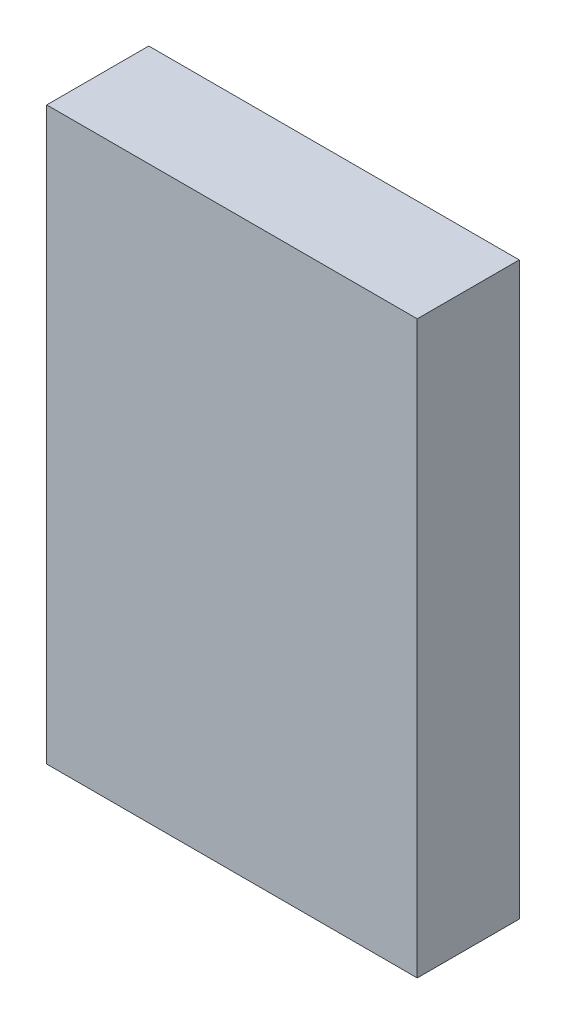
ISO-10303-21;
HEADER;
FILE_DESCRIPTION(('STEP AP214'),'2;1');
FILE_NAME('part.step','',(''),(''),'','','');
FILE_SCHEMA(('AUTOMOTIVE_DESIGN { 1 0 10303 214 1 1 1 1 }'));
ENDSEC;
DATA;
#1=APPLICATION_CONTEXT('core data for automotive mechanical design processes');
#2=APPLICATION_PROTOCOL_DEFINITION('international standard','automotive_design',2000,#1);
#3=PRODUCT_CONTEXT('',#1,'mechanical');
#4=PRODUCT('Part','Part','',(#3));
#5=PRODUCT_RELATED_PRODUCT_CATEGORY('part','',(#4));
#6=PRODUCT_DEFINITION_FORMATION('','',#4);
#7=PRODUCT_DEFINITION_CONTEXT('part definition',#1,'design');
#8=PRODUCT_DEFINITION('design','',#6,#7);
#9=PRODUCT_DEFINITION_SHAPE('','',#8);
#10=(LENGTH_UNIT() NAMED_UNIT(*) SI_UNIT(.MILLI.,.METRE.));
#11=(NAMED_UNIT(*) PLANE_ANGLE_UNIT() SI_UNIT($,.RADIAN.));
#12=(NAMED_UNIT(*) SI_UNIT($,.STERADIAN.) SOLID_ANGLE_UNIT());
#13=UNCERTAINTY_MEASURE_WITH_UNIT(LENGTH_MEASURE(1.E-05),#10,'distance_accuracy_value','');
#14=(GEOMETRIC_REPRESENTATION_CONTEXT(3) GLOBAL_UNCERTAINTY_ASSIGNED_CONTEXT((#13)) GLOBAL_UNIT_ASSIGNED_CONTEXT((#10,
#11,#12)) REPRESENTATION_CONTEXT('',''));
#15=CARTESIAN_POINT('',(0.,0.,0.));
#16=DIRECTION('',(0.,0.,1.));
#17=DIRECTION('',(1.,0.,0.));
#18=AXIS2_PLACEMENT_3D('',#15,#16,#17);
#19=CARTESIAN_POINT('',(-60.0311997987015,185.,-16.5284140414927));
#20=DIRECTION('',(0.,0.,1.));
#21=DIRECTION('',(1.,0.,0.));
#22=AXIS2_PLACEMENT_3D('',#19,#20,#21);
#23=PLANE('',#22);
#24=DIRECTION('',(0.294185369650994,-0.95574838126115,0.));
#25=VECTOR('',#24,1.);
#26=CARTESIAN_POINT('',(18.318675865846,126.434470158317,-16.5284140414927));
#27=LINE('',#26,#25);
#28=CARTESIAN_POINT('',(18.3186758658462,126.434470158317,-16.5284140414927));
#29=VERTEX_POINT('',#28);
#30=CARTESIAN_POINT('',(57.2360018790709,0.,-16.5284140414927));
#31=VERTEX_POINT('',#30);
#32=EDGE_CURVE('E199',#29,#31,#27,.T.);
#33=ORIENTED_EDGE('',*,*,#32,.F.);
#34=CARTESIAN_POINT('',(-14.7698838771279,116.249603126305,-16.5284140414927));
#35=DIRECTION('',(0.,0.,1.));
#36=DIRECTION('',(1.,0.,0.));
#37=AXIS2_PLACEMENT_3D('',#34,#35,#36);
#38=CIRCLE('',#37,34.6205762852692);
#39=CARTESIAN_POINT('',(-14.769883877128,150.870179411574,-16.5284140414927));
#40=VERTEX_POINT('',#39);
#41=EDGE_CURVE('E11',#40,#29,#38,.F.);
#42=ORIENTED_EDGE('',*,*,#41,.F.);
#43=DIRECTION('',(1.,0.,0.));
#44=VECTOR('',#43,1.);
#45=CARTESIAN_POINT('',(-61.0311997987015,150.870179411574,-16.5284140414927));
#46=LINE('',#45,#44);
#47=CARTESIAN_POINT('',(-60.0311997987015,150.870179411574,-16.5284140414927));
#48=VERTEX_POINT('',#47);
#49=EDGE_CURVE('E224',#48,#40,#46,.T.);
#50=ORIENTED_EDGE('',*,*,#49,.F.);
#51=DIRECTION('',(0.,-1.,0.));
#52=VECTOR('',#51,1.);
#53=CARTESIAN_POINT('',(-60.0311997987015,185.,-16.5284140414927));
#54=LINE('',#53,#52);
#55=CARTESIAN_POINT('',(-60.0311997987015,185.,-16.5284140414927));
#56=VERTEX_POINT('',#55);
#57=EDGE_CURVE('E257',#56,#48,#54,.T.);
#58=ORIENTED_EDGE('',*,*,#57,.F.);
#59=DIRECTION('',(-1.,0.,0.));
#60=VECTOR('',#59,1.);
#61=CARTESIAN_POINT('',(-60.0311997987015,185.,-16.5284140414927));
#62=LINE('',#61,#60);
#63=CARTESIAN_POINT('',(60.0311997987015,185.,-16.5284140414927));
#64=VERTEX_POINT('',#63);
#65=EDGE_CURVE('E97',#64,#56,#62,.T.);
#66=ORIENTED_EDGE('',*,*,#65,.F.);
#67=DIRECTION('',(0.,-1.,0.));
#68=VECTOR('',#67,1.);
#69=CARTESIAN_POINT('',(60.0311997987015,185.,-16.5284140414927));
#70=LINE('',#69,#68);
#71=CARTESIAN_POINT('',(60.0311997987015,0.,-16.5284140414927));
#72=VERTEX_POINT('',#71);
#73=EDGE_CURVE('E261',#64,#72,#70,.T.);
#74=ORIENTED_EDGE('',*,*,#73,.T.);
#75=DIRECTION('',(-1.,0.,0.));
#76=VECTOR('',#75,1.);
#77=CARTESIAN_POINT('',(-60.0311997987015,0.,-16.5284140414927));
#78=LINE('',#77,#76);
#79=EDGE_CURVE('E242',#72,#31,#78,.T.);
#80=ORIENTED_EDGE('',*,*,#79,.T.);
#81=EDGE_LOOP('',(#33,#42,#50,#58,#66,#74,#80));
#82=FACE_BOUND('',#81,.T.);
#83=ADVANCED_FACE('F43',(#82),#23,.F.);
#84=DIRECTION('',(0.294185369650994,-0.95574838126115,0.));
#85=VECTOR('',#84,1.);
#86=CARTESIAN_POINT('',(-9.62850836965575,117.832150880333,-16.5284140414927));
#87=LINE('',#86,#85);
#88=CARTESIAN_POINT('',(26.6409696050399,0.,-16.5284140414927));
#89=VERTEX_POINT('',#88);
#90=CARTESIAN_POINT('',(-9.6285083696556,117.832150880333,-16.5284140414927));
#91=VERTEX_POINT('',#90);
#92=EDGE_CURVE('E196',#89,#91,#87,.F.);
#93=ORIENTED_EDGE('',*,*,#92,.F.);
#94=CARTESIAN_POINT('',(-60.0311997987015,0.,-16.5284140414927));
#95=VERTEX_POINT('',#94);
#96=EDGE_CURVE('E194',#89,#95,#78,.T.);
#97=ORIENTED_EDGE('',*,*,#96,.T.);
#98=CARTESIAN_POINT('',(-60.0311997987015,121.629026841036,-16.5284140414927));
#99=VERTEX_POINT('',#98);
#100=EDGE_CURVE('E256',#99,#95,#54,.T.);
#101=ORIENTED_EDGE('',*,*,#100,.F.);
#102=DIRECTION('',(1.,0.,0.));
#103=VECTOR('',#102,1.);
#104=CARTESIAN_POINT('',(-61.0311997987015,121.629026841036,-16.5284140414927));
#105=LINE('',#104,#103);
#106=CARTESIAN_POINT('',(-14.769883877128,121.629026841036,-16.5284140414927));
#107=VERTEX_POINT('',#106);
#108=EDGE_CURVE('E221',#107,#99,#105,.F.);
#109=ORIENTED_EDGE('',*,*,#108,.F.);
#110=CARTESIAN_POINT('',(-14.7698838771279,116.249603126305,-16.5284140414927));
#111=DIRECTION('',(0.,0.,-1.));
#112=DIRECTION('',(-1.,0.,0.));
#113=AXIS2_PLACEMENT_3D('',#110,#111,#112);
#114=CIRCLE('',#113,5.37942371473145);
#115=EDGE_CURVE('E52',#91,#107,#114,.F.);
#116=ORIENTED_EDGE('',*,*,#115,.F.);
#117=EDGE_LOOP('',(#93,#97,#101,#109,#116));
#118=FACE_BOUND('',#117,.T.);
#119=ADVANCED_FACE('F390',(#118),#23,.F.);
#120=CARTESIAN_POINT('',(60.0311997987015,185.,16.5284140414927));
#121=DIRECTION('',(-1.,0.,0.));
#122=DIRECTION('',(0.,0.,1.));
#123=AXIS2_PLACEMENT_3D('',#120,#121,#122);
#124=PLANE('',#123);
#125=DIRECTION('',(0.,0.,-1.));
#126=VECTOR('',#125,1.);
#127=CARTESIAN_POINT('',(60.0311997987015,0.,16.5284140414927));
#128=LINE('',#127,#126);
#129=CARTESIAN_POINT('',(60.0311997987015,0.,16.5284140414927));
#130=VERTEX_POINT('',#129);
#131=EDGE_CURVE('E227',#130,#72,#128,.T.);
#132=ORIENTED_EDGE('',*,*,#131,.T.);
#133=ORIENTED_EDGE('',*,*,#73,.F.);
#134=DIRECTION('',(0.,0.,-1.));
#135=VECTOR('',#134,1.);
#136=CARTESIAN_POINT('',(60.0311997987015,185.,16.5284140414927));
#137=LINE('',#136,#135);
#138=CARTESIAN_POINT('',(60.0311997987015,185.,16.5284140414927));
#139=VERTEX_POINT('',#138);
#140=EDGE_CURVE('E228',#139,#64,#137,.T.);
#141=ORIENTED_EDGE('',*,*,#140,.F.);
#142=DIRECTION('',(0.,-1.,0.));
#143=VECTOR('',#142,1.);
#144=CARTESIAN_POINT('',(60.0311997987015,185.,16.5284140414927));
#145=LINE('',#144,#143);
#146=EDGE_CURVE('E238',#139,#130,#145,.T.);
#147=ORIENTED_EDGE('',*,*,#146,.T.);
#148=EDGE_LOOP('',(#132,#133,#141,#147));
#149=FACE_BOUND('',#148,.T.);
#150=ADVANCED_FACE('F45',(#149),#124,.F.);
#151=CARTESIAN_POINT('',(-60.0311997987015,185.,16.5284140414927));
#152=DIRECTION('',(1.,0.,0.));
#153=DIRECTION('',(0.,0.,-1.));
#154=AXIS2_PLACEMENT_3D('',#151,#152,#153);
#155=PLANE('',#154);
#156=DIRECTION('',(0.,0.,-1.));
#157=VECTOR('',#156,1.);
#158=CARTESIAN_POINT('',(-60.0311997987015,127.771476102538,6.29921731849201));
#159=LINE('',#158,#157);
#160=CARTESIAN_POINT('',(-60.0311997987015,127.771476102538,6.29921731849201));
#161=VERTEX_POINT('',#160);
#162=CARTESIAN_POINT('',(-60.0311997987015,127.771476102538,-4.61696521768333));
#163=VERTEX_POINT('',#162);
#164=EDGE_CURVE('E283',#161,#163,#159,.T.);
#165=ORIENTED_EDGE('',*,*,#164,.T.);
#166=CARTESIAN_POINT('',(-60.0311997987015,136.249603126305,-16.5284140414927));
#167=DIRECTION('',(1.,0.,0.));
#168=DIRECTION('',(0.,0.,-1.));
#169=AXIS2_PLACEMENT_3D('',#166,#167,#168);
#170=CIRCLE('',#169,14.6205762852689);
#171=EDGE_CURVE('E278',#163,#99,#170,.T.);
#172=ORIENTED_EDGE('',*,*,#171,.T.);
#173=ORIENTED_EDGE('',*,*,#100,.T.);
#174=DIRECTION('',(0.,0.,1.));
#175=VECTOR('',#174,1.);
#176=CARTESIAN_POINT('',(-60.0311997987015,0.,16.5284140414927));
#177=LINE('',#176,#175);
#178=CARTESIAN_POINT('',(-60.0311997987015,0.,16.5284140414927));
#179=VERTEX_POINT('',#178);
#180=EDGE_CURVE('E246',#95,#179,#177,.T.);
#181=ORIENTED_EDGE('',*,*,#180,.T.);
#182=DIRECTION('',(0.,-1.,0.));
#183=VECTOR('',#182,1.);
#184=CARTESIAN_POINT('',(-60.0311997987015,185.,16.5284140414927));
#185=LINE('',#184,#183);
#186=CARTESIAN_POINT('',(-60.0311997987015,185.,16.5284140414927));
#187=VERTEX_POINT('',#186);
#188=EDGE_CURVE('E253',#187,#179,#185,.T.);
#189=ORIENTED_EDGE('',*,*,#188,.F.);
#190=DIRECTION('',(0.,0.,1.));
#191=VECTOR('',#190,1.);
#192=CARTESIAN_POINT('',(-60.0311997987015,185.,16.5284140414927));
#193=LINE('',#192,#191);
#194=EDGE_CURVE('E233',#56,#187,#193,.T.);
#195=ORIENTED_EDGE('',*,*,#194,.F.);
#196=ORIENTED_EDGE('',*,*,#57,.T.);
#197=CARTESIAN_POINT('',(-60.0311997987015,136.249603126305,-16.5284140414927));
#198=DIRECTION('',(1.,0.,0.));
#199=DIRECTION('',(0.,0.,-1.));
#200=AXIS2_PLACEMENT_3D('',#197,#198,#199);
#201=CIRCLE('',#200,14.6205762852689);
#202=CARTESIAN_POINT('',(-60.0311997987015,144.727730150073,-4.61696521768333));
#203=VERTEX_POINT('',#202);
#204=EDGE_CURVE('E264',#48,#203,#201,.T.);
#205=ORIENTED_EDGE('',*,*,#204,.T.);
#206=DIRECTION('',(0.,0.,1.));
#207=VECTOR('',#206,1.);
#208=CARTESIAN_POINT('',(-60.0311997987015,144.727730150073,6.29921731849201));
#209=LINE('',#208,#207);
#210=CARTESIAN_POINT('',(-60.0311997987015,144.727730150073,6.29921731849201));
#211=VERTEX_POINT('',#210);
#212=EDGE_CURVE('E375',#203,#211,#209,.T.);
#213=ORIENTED_EDGE('',*,*,#212,.T.);
#214=DIRECTION('',(0.,-1.,0.));
#215=VECTOR('',#214,1.);
#216=CARTESIAN_POINT('',(-60.0311997987015,127.771476102538,6.29921731849201));
#217=LINE('',#216,#215);
#218=EDGE_CURVE('E287',#211,#161,#217,.T.);
#219=ORIENTED_EDGE('',*,*,#218,.T.);
#220=EDGE_LOOP('',(#165,#172,#173,#181,#189,#195,#196,#205,#213,#219));
#221=FACE_BOUND('',#220,.T.);
#222=ADVANCED_FACE('F387',(#221),#155,.F.);
#223=CARTESIAN_POINT('',(-60.0311997987015,185.,16.5284140414927));
#224=DIRECTION('',(0.,0.,-1.));
#225=DIRECTION('',(-1.,0.,0.));
#226=AXIS2_PLACEMENT_3D('',#223,#224,#225);
#227=PLANE('',#226);
#228=DIRECTION('',(1.,0.,0.));
#229=VECTOR('',#228,1.);
#230=CARTESIAN_POINT('',(-60.0311997987015,0.,16.5284140414927));
#231=LINE('',#230,#229);
#232=EDGE_CURVE('E89',#179,#130,#231,.T.);
#233=ORIENTED_EDGE('',*,*,#232,.T.);
#234=ORIENTED_EDGE('',*,*,#146,.F.);
#235=DIRECTION('',(1.,0.,0.));
#236=VECTOR('',#235,1.);
#237=CARTESIAN_POINT('',(-60.0311997987015,185.,16.5284140414927));
#238=LINE('',#237,#236);
#239=EDGE_CURVE('E68',#187,#139,#238,.T.);
#240=ORIENTED_EDGE('',*,*,#239,.F.);
#241=ORIENTED_EDGE('',*,*,#188,.T.);
#242=EDGE_LOOP('',(#233,#234,#240,#241));
#243=FACE_BOUND('',#242,.T.);
#244=ADVANCED_FACE('F395',(#243),#227,.F.);
#245=CARTESIAN_POINT('',(0.,185.,0.));
#246=DIRECTION('',(0.,-1.,0.));
#247=DIRECTION('',(0.,0.,-1.));
#248=AXIS2_PLACEMENT_3D('',#245,#246,#247);
#249=PLANE('',#248);
#250=ORIENTED_EDGE('',*,*,#140,.T.);
#251=ORIENTED_EDGE('',*,*,#65,.T.);
#252=ORIENTED_EDGE('',*,*,#194,.T.);
#253=ORIENTED_EDGE('',*,*,#239,.T.);
#254=EDGE_LOOP('',(#250,#251,#252,#253));
#255=FACE_BOUND('',#254,.T.);
#256=ADVANCED_FACE('F399',(#255),#249,.F.);
#257=CARTESIAN_POINT('',(0.,0.,0.));
#258=DIRECTION('',(0.,-1.,0.));
#259=DIRECTION('',(0.,0.,-1.));
#260=AXIS2_PLACEMENT_3D('',#257,#258,#259);
#261=PLANE('',#260);
#262=CARTESIAN_POINT('',(41.9384857420554,0.,-16.5284140414927));
#263=DIRECTION('',(0.,-1.,0.));
#264=DIRECTION('',(1.,0.,0.));
#265=AXIS2_PLACEMENT_3D('',#262,#263,#264);
#266=ELLIPSE('',#265,15.2975161370155,14.6205762852689);
#267=CARTESIAN_POINT('',(50.8091542045856,0.,-4.61696521768333));
#268=VERTEX_POINT('',#267);
#269=EDGE_CURVE('E202',#31,#268,#266,.T.);
#270=ORIENTED_EDGE('',*,*,#269,.F.);
#271=ORIENTED_EDGE('',*,*,#79,.F.);
#272=ORIENTED_EDGE('',*,*,#131,.F.);
#273=ORIENTED_EDGE('',*,*,#232,.F.);
#274=ORIENTED_EDGE('',*,*,#180,.F.);
#275=ORIENTED_EDGE('',*,*,#96,.F.);
#276=CARTESIAN_POINT('',(41.9384857420554,0.,-16.5284140414927));
#277=DIRECTION('',(0.,-1.,0.));
#278=DIRECTION('',(1.,0.,0.));
#279=AXIS2_PLACEMENT_3D('',#276,#277,#278);
#280=ELLIPSE('',#279,15.2975161370155,14.6205762852689);
#281=CARTESIAN_POINT('',(33.0678172795253,0.,-4.61696521768333));
#282=VERTEX_POINT('',#281);
#283=EDGE_CURVE('E170',#282,#89,#280,.T.);
#284=ORIENTED_EDGE('',*,*,#283,.F.);
#285=DIRECTION('',(0.,0.,-1.));
#286=VECTOR('',#285,1.);
#287=CARTESIAN_POINT('',(33.0678172795253,0.,6.29921731849201));
#288=LINE('',#287,#286);
#289=CARTESIAN_POINT('',(33.0678172795253,0.,6.29921731849201));
#290=VERTEX_POINT('',#289);
#291=EDGE_CURVE('E181',#290,#282,#288,.T.);
#292=ORIENTED_EDGE('',*,*,#291,.F.);
#293=DIRECTION('',(-1.,0.,0.));
#294=VECTOR('',#293,1.);
#295=CARTESIAN_POINT('',(-3.75787243099708,0.,6.29921731849201));
#296=LINE('',#295,#294);
#297=CARTESIAN_POINT('',(50.8091542045856,0.,6.29921731849201));
#298=VERTEX_POINT('',#297);
#299=EDGE_CURVE('E187',#298,#290,#296,.T.);
#300=ORIENTED_EDGE('',*,*,#299,.F.);
#301=DIRECTION('',(0.,0.,1.));
#302=VECTOR('',#301,1.);
#303=CARTESIAN_POINT('',(50.8091542045856,0.,6.29921731849201));
#304=LINE('',#303,#302);
#305=EDGE_CURVE('E207',#268,#298,#304,.T.);
#306=ORIENTED_EDGE('',*,*,#305,.F.);
#307=EDGE_LOOP('',(#270,#271,#272,#273,#274,#275,#284,#292,#300,#306));
#308=FACE_BOUND('',#307,.T.);
#309=ADVANCED_FACE('F191',(#308),#261,.T.);
#310=CARTESIAN_POINT('',(-14.7698838771279,116.249603126305,-16.5284140414927));
#311=DIRECTION('',(0.,0.,-1.));
#312=DIRECTION('',(-1.,0.,0.));
#313=AXIS2_PLACEMENT_3D('',#310,#311,#312);
#314=TOROIDAL_SURFACE('',#313,20.0000000000003,14.6205762852689);
#315=ORIENTED_EDGE('',*,*,#41,.T.);
#316=CARTESIAN_POINT('',(4.34508374809515,122.133310519325,-16.5284140414927));
#317=DIRECTION('',(-0.294185369650989,0.955748381261151,0.));
#318=DIRECTION('',(0.,0.,1.));
#319=AXIS2_PLACEMENT_3D('',#316,#317,#318);
#320=CIRCLE('',#319,14.6205762852689);
#321=CARTESIAN_POINT('',(12.4480399271877,124.62745145176,-4.61696521768333));
#322=VERTEX_POINT('',#321);
#323=EDGE_CURVE('E313',#322,#29,#320,.T.);
#324=ORIENTED_EDGE('',*,*,#323,.F.);
#325=CARTESIAN_POINT('',(-14.7698838771279,116.249603126305,-4.61696521768333));
#326=DIRECTION('',(0.,0.,-1.));
#327=DIRECTION('',(0.,1.,0.));
#328=AXIS2_PLACEMENT_3D('',#325,#326,#327);
#329=CIRCLE('',#328,28.4781270237679);
#330=CARTESIAN_POINT('',(-14.769883877128,144.727730150073,-4.61696521768333));
#331=VERTEX_POINT('',#330);
#332=EDGE_CURVE('E317',#331,#322,#329,.T.);
#333=ORIENTED_EDGE('',*,*,#332,.F.);
#334=CARTESIAN_POINT('',(-14.769883877128,136.249603126305,-16.5284140414927));
#335=DIRECTION('',(-1.,0.,0.));
#336=DIRECTION('',(0.,0.,1.));
#337=AXIS2_PLACEMENT_3D('',#334,#335,#336);
#338=CIRCLE('',#337,14.6205762852689);
#339=EDGE_CURVE('E276',#331,#40,#338,.T.);
#340=ORIENTED_EDGE('',*,*,#339,.T.);
#341=EDGE_LOOP('',(#315,#324,#333,#340));
#342=FACE_BOUND('',#341,.T.);
#343=ADVANCED_FACE('F334',(#342),#314,.F.);
#344=CARTESIAN_POINT('',(-14.7698838771279,116.249603126305,-16.5284140414927));
#345=DIRECTION('',(0.,0.,-1.));
#346=DIRECTION('',(-1.,0.,0.));
#347=AXIS2_PLACEMENT_3D('',#344,#345,#346);
#348=TOROIDAL_SURFACE('',#347,20.0000000000003,14.6205762852689);
#349=ORIENTED_EDGE('',*,*,#115,.T.);
#350=CARTESIAN_POINT('',(-14.769883877128,136.249603126305,-16.5284140414927));
#351=DIRECTION('',(-1.,0.,0.));
#352=DIRECTION('',(0.,0.,1.));
#353=AXIS2_PLACEMENT_3D('',#350,#351,#352);
#354=CIRCLE('',#353,14.6205762852689);
#355=CARTESIAN_POINT('',(-14.769883877128,127.771476102538,-4.61696521768333));
#356=VERTEX_POINT('',#355);
#357=EDGE_CURVE('E282',#107,#356,#354,.T.);
#358=ORIENTED_EDGE('',*,*,#357,.T.);
#359=CARTESIAN_POINT('',(-14.7698838771279,116.249603126305,-4.61696521768333));
#360=DIRECTION('',(0.,0.,-1.));
#361=DIRECTION('',(0.,1.,0.));
#362=AXIS2_PLACEMENT_3D('',#359,#360,#361);
#363=CIRCLE('',#362,11.5218729762328);
#364=CARTESIAN_POINT('',(-3.75787243099675,119.63916958689,-4.61696521768333));
#365=VERTEX_POINT('',#364);
#366=EDGE_CURVE('E307',#356,#365,#363,.T.);
#367=ORIENTED_EDGE('',*,*,#366,.T.);
#368=CARTESIAN_POINT('',(4.34508374809515,122.133310519325,-16.5284140414927));
#369=DIRECTION('',(-0.294185369650989,0.955748381261151,0.));
#370=DIRECTION('',(0.,0.,1.));
#371=AXIS2_PLACEMENT_3D('',#368,#369,#370);
#372=CIRCLE('',#371,14.6205762852689);
#373=EDGE_CURVE('E173',#91,#365,#372,.T.);
#374=ORIENTED_EDGE('',*,*,#373,.F.);
#375=EDGE_LOOP('',(#349,#358,#367,#374));
#376=FACE_BOUND('',#375,.T.);
#377=ADVANCED_FACE('F379',(#376),#348,.F.);
#378=CARTESIAN_POINT('',(-61.0311997987015,136.249603126305,-16.5284140414927));
#379=DIRECTION('',(1.,0.,0.));
#380=DIRECTION('',(0.,0.,-1.));
#381=AXIS2_PLACEMENT_3D('',#378,#379,#380);
#382=CYLINDRICAL_SURFACE('',#381,14.6205762852689);
#383=ORIENTED_EDGE('',*,*,#49,.T.);
#384=ORIENTED_EDGE('',*,*,#339,.F.);
#385=DIRECTION('',(1.,0.,0.));
#386=VECTOR('',#385,1.);
#387=CARTESIAN_POINT('',(-61.0311997987015,144.727730150073,-4.61696521768333));
#388=LINE('',#387,#386);
#389=EDGE_CURVE('E214',#203,#331,#388,.T.);
#390=ORIENTED_EDGE('',*,*,#389,.F.);
#391=ORIENTED_EDGE('',*,*,#204,.F.);
#392=EDGE_LOOP('',(#383,#384,#390,#391));
#393=FACE_BOUND('',#392,.T.);
#394=ADVANCED_FACE('F460',(#393),#382,.F.);
#395=CARTESIAN_POINT('',(-61.0311997987015,136.249603126305,-16.5284140414927));
#396=DIRECTION('',(1.,0.,0.));
#397=DIRECTION('',(0.,0.,-1.));
#398=AXIS2_PLACEMENT_3D('',#395,#396,#397);
#399=CYLINDRICAL_SURFACE('',#398,14.6205762852689);
#400=ORIENTED_EDGE('',*,*,#108,.T.);
#401=ORIENTED_EDGE('',*,*,#171,.F.);
#402=DIRECTION('',(1.,0.,0.));
#403=VECTOR('',#402,1.);
#404=CARTESIAN_POINT('',(-61.0311997987015,127.771476102538,-4.61696521768333));
#405=LINE('',#404,#403);
#406=EDGE_CURVE('E286',#163,#356,#405,.T.);
#407=ORIENTED_EDGE('',*,*,#406,.T.);
#408=ORIENTED_EDGE('',*,*,#357,.F.);
#409=EDGE_LOOP('',(#400,#401,#407,#408));
#410=FACE_BOUND('',#409,.T.);
#411=ADVANCED_FACE('F383',(#410),#399,.F.);
#412=CARTESIAN_POINT('',(4.34508374809514,122.133310519325,-16.5284140414927));
#413=DIRECTION('',(0.294185369650994,-0.95574838126115,0.));
#414=DIRECTION('',(0.95574838126115,0.294185369650994,0.));
#415=AXIS2_PLACEMENT_3D('',#412,#413,#414);
#416=CYLINDRICAL_SURFACE('',#415,14.6205762852689);
#417=ORIENTED_EDGE('',*,*,#32,.T.);
#418=ORIENTED_EDGE('',*,*,#269,.T.);
#419=DIRECTION('',(0.294185369650994,-0.95574838126115,0.));
#420=VECTOR('',#419,1.);
#421=CARTESIAN_POINT('',(12.4480399271874,124.62745145176,-4.61696521768333));
#422=LINE('',#421,#420);
#423=EDGE_CURVE('E59',#322,#268,#422,.T.);
#424=ORIENTED_EDGE('',*,*,#423,.F.);
#425=ORIENTED_EDGE('',*,*,#323,.T.);
#426=EDGE_LOOP('',(#417,#418,#424,#425));
#427=FACE_BOUND('',#426,.T.);
#428=ADVANCED_FACE('F341',(#427),#416,.F.);
#429=CARTESIAN_POINT('',(4.34508374809514,122.133310519325,-16.5284140414927));
#430=DIRECTION('',(0.294185369650994,-0.95574838126115,0.));
#431=DIRECTION('',(0.95574838126115,0.294185369650994,0.));
#432=AXIS2_PLACEMENT_3D('',#429,#430,#431);
#433=CYLINDRICAL_SURFACE('',#432,14.6205762852689);
#434=ORIENTED_EDGE('',*,*,#92,.T.);
#435=ORIENTED_EDGE('',*,*,#373,.T.);
#436=DIRECTION('',(0.294185369650994,-0.95574838126115,0.));
#437=VECTOR('',#436,1.);
#438=CARTESIAN_POINT('',(-3.75787243099708,119.63916958689,-4.61696521768333));
#439=LINE('',#438,#437);
#440=EDGE_CURVE('E166',#365,#282,#439,.T.);
#441=ORIENTED_EDGE('',*,*,#440,.T.);
#442=ORIENTED_EDGE('',*,*,#283,.T.);
#443=EDGE_LOOP('',(#434,#435,#441,#442));
#444=FACE_BOUND('',#443,.T.);
#445=ADVANCED_FACE('F168',(#444),#433,.F.);
#446=CARTESIAN_POINT('',(-3.75787243099708,119.63916958689,6.29921731849201));
#447=DIRECTION('',(0.95574838126115,0.294185369650994,0.));
#448=DIRECTION('',(-0.294185369650994,0.95574838126115,0.));
#449=AXIS2_PLACEMENT_3D('',#446,#447,#448);
#450=PLANE('',#449);
#451=ORIENTED_EDGE('',*,*,#291,.T.);
#452=ORIENTED_EDGE('',*,*,#440,.F.);
#453=DIRECTION('',(0.,0.,1.));
#454=VECTOR('',#453,1.);
#455=CARTESIAN_POINT('',(-3.75787243099707,119.63916958689,6.29921731849201));
#456=LINE('',#455,#454);
#457=CARTESIAN_POINT('',(-3.75787243099675,119.63916958689,6.29921731849201));
#458=VERTEX_POINT('',#457);
#459=EDGE_CURVE('E311',#365,#458,#456,.T.);
#460=ORIENTED_EDGE('',*,*,#459,.T.);
#461=DIRECTION('',(0.294185369650994,-0.95574838126115,0.));
#462=VECTOR('',#461,1.);
#463=CARTESIAN_POINT('',(-3.75787243099708,119.63916958689,6.29921731849201));
#464=LINE('',#463,#462);
#465=EDGE_CURVE('E178',#458,#290,#464,.T.);
#466=ORIENTED_EDGE('',*,*,#465,.T.);
#467=EDGE_LOOP('',(#451,#452,#460,#466));
#468=FACE_BOUND('',#467,.T.);
#469=ADVANCED_FACE('F182',(#468),#450,.T.);
#470=CARTESIAN_POINT('',(-3.75787243099708,119.63916958689,6.29921731849201));
#471=DIRECTION('',(0.,0.,-1.));
#472=DIRECTION('',(-1.,0.,0.));
#473=AXIS2_PLACEMENT_3D('',#470,#471,#472);
#474=PLANE('',#473);
#475=ORIENTED_EDGE('',*,*,#299,.T.);
#476=ORIENTED_EDGE('',*,*,#465,.F.);
#477=DIRECTION('',(0.955748381261151,0.294185369650989,0.));
#478=VECTOR('',#477,1.);
#479=CARTESIAN_POINT('',(-3.75787243099707,119.63916958689,6.29921731849201));
#480=LINE('',#479,#478);
#481=CARTESIAN_POINT('',(12.4480399271877,124.62745145176,6.29921731849201));
#482=VERTEX_POINT('',#481);
#483=EDGE_CURVE('E354',#458,#482,#480,.T.);
#484=ORIENTED_EDGE('',*,*,#483,.T.);
#485=DIRECTION('',(0.294185369650994,-0.95574838126115,0.));
#486=VECTOR('',#485,1.);
#487=CARTESIAN_POINT('',(12.4480399271874,124.62745145176,6.29921731849201));
#488=LINE('',#487,#486);
#489=EDGE_CURVE('E211',#482,#298,#488,.T.);
#490=ORIENTED_EDGE('',*,*,#489,.T.);
#491=EDGE_LOOP('',(#475,#476,#484,#490));
#492=FACE_BOUND('',#491,.T.);
#493=ADVANCED_FACE('F364',(#492),#474,.T.);
#494=CARTESIAN_POINT('',(12.4480399271874,124.62745145176,6.29921731849201));
#495=DIRECTION('',(-0.95574838126115,-0.294185369650994,0.));
#496=DIRECTION('',(0.294185369650994,-0.95574838126115,0.));
#497=AXIS2_PLACEMENT_3D('',#494,#495,#496);
#498=PLANE('',#497);
#499=ORIENTED_EDGE('',*,*,#305,.T.);
#500=ORIENTED_EDGE('',*,*,#489,.F.);
#501=DIRECTION('',(0.,0.,-1.));
#502=VECTOR('',#501,1.);
#503=CARTESIAN_POINT('',(12.4480399271874,124.62745145176,6.29921731849201));
#504=LINE('',#503,#502);
#505=EDGE_CURVE('E346',#482,#322,#504,.T.);
#506=ORIENTED_EDGE('',*,*,#505,.T.);
#507=ORIENTED_EDGE('',*,*,#423,.T.);
#508=EDGE_LOOP('',(#499,#500,#506,#507));
#509=FACE_BOUND('',#508,.T.);
#510=ADVANCED_FACE('F344',(#509),#498,.T.);
#511=CARTESIAN_POINT('',(-61.0311997987015,127.771476102538,6.29921731849201));
#512=DIRECTION('',(0.,1.,0.));
#513=DIRECTION('',(0.,0.,1.));
#514=AXIS2_PLACEMENT_3D('',#511,#512,#513);
#515=PLANE('',#514);
#516=DIRECTION('',(1.,0.,0.));
#517=VECTOR('',#516,1.);
#518=CARTESIAN_POINT('',(-61.0311997987015,127.771476102538,6.29921731849201));
#519=LINE('',#518,#517);
#520=CARTESIAN_POINT('',(-14.769883877128,127.771476102538,6.29921731849201));
#521=VERTEX_POINT('',#520);
#522=EDGE_CURVE('E290',#161,#521,#519,.T.);
#523=ORIENTED_EDGE('',*,*,#522,.T.);
#524=DIRECTION('',(0.,0.,1.));
#525=VECTOR('',#524,1.);
#526=CARTESIAN_POINT('',(-14.769883877128,127.771476102538,6.29921731849201));
#527=LINE('',#526,#525);
#528=EDGE_CURVE('E291',#356,#521,#527,.T.);
#529=ORIENTED_EDGE('',*,*,#528,.F.);
#530=ORIENTED_EDGE('',*,*,#406,.F.);
#531=ORIENTED_EDGE('',*,*,#164,.F.);
#532=EDGE_LOOP('',(#523,#529,#530,#531));
#533=FACE_BOUND('',#532,.T.);
#534=ADVANCED_FACE('F385',(#533),#515,.T.);
#535=CARTESIAN_POINT('',(-61.0311997987015,127.771476102538,6.29921731849201));
#536=DIRECTION('',(0.,0.,-1.));
#537=DIRECTION('',(-1.,0.,0.));
#538=AXIS2_PLACEMENT_3D('',#535,#536,#537);
#539=PLANE('',#538);
#540=DIRECTION('',(1.,0.,0.));
#541=VECTOR('',#540,1.);
#542=CARTESIAN_POINT('',(-61.0311997987015,144.727730150073,6.29921731849201));
#543=LINE('',#542,#541);
#544=CARTESIAN_POINT('',(-14.769883877128,144.727730150073,6.29921731849201));
#545=VERTEX_POINT('',#544);
#546=EDGE_CURVE('E372',#211,#545,#543,.T.);
#547=ORIENTED_EDGE('',*,*,#546,.T.);
#548=DIRECTION('',(0.,1.,0.));
#549=VECTOR('',#548,1.);
#550=CARTESIAN_POINT('',(-14.769883877128,127.771476102538,6.29921731849201));
#551=LINE('',#550,#549);
#552=EDGE_CURVE('E294',#521,#545,#551,.T.);
#553=ORIENTED_EDGE('',*,*,#552,.F.);
#554=ORIENTED_EDGE('',*,*,#522,.F.);
#555=ORIENTED_EDGE('',*,*,#218,.F.);
#556=EDGE_LOOP('',(#547,#553,#554,#555));
#557=FACE_BOUND('',#556,.T.);
#558=ADVANCED_FACE('F532',(#557),#539,.T.);
#559=CARTESIAN_POINT('',(-61.0311997987015,144.727730150073,6.29921731849201));
#560=DIRECTION('',(0.,-1.,0.));
#561=DIRECTION('',(0.,0.,-1.));
#562=AXIS2_PLACEMENT_3D('',#559,#560,#561);
#563=PLANE('',#562);
#564=ORIENTED_EDGE('',*,*,#389,.T.);
#565=DIRECTION('',(0.,0.,-1.));
#566=VECTOR('',#565,1.);
#567=CARTESIAN_POINT('',(-14.769883877128,144.727730150073,6.29921731849201));
#568=LINE('',#567,#566);
#569=EDGE_CURVE('E321',#545,#331,#568,.T.);
#570=ORIENTED_EDGE('',*,*,#569,.F.);
#571=ORIENTED_EDGE('',*,*,#546,.F.);
#572=ORIENTED_EDGE('',*,*,#212,.F.);
#573=EDGE_LOOP('',(#564,#570,#571,#572));
#574=FACE_BOUND('',#573,.T.);
#575=ADVANCED_FACE('F542',(#574),#563,.T.);
#576=CARTESIAN_POINT('',(-14.7698838771279,116.249603126305,-16.5284140414927));
#577=DIRECTION('',(0.,0.,-1.));
#578=DIRECTION('',(-1.,0.,0.));
#579=AXIS2_PLACEMENT_3D('',#576,#577,#578);
#580=CYLINDRICAL_SURFACE('',#579,11.5218729762328);
#581=CARTESIAN_POINT('',(-14.7698838771279,116.249603126305,6.29921731849201));
#582=DIRECTION('',(0.,0.,-1.));
#583=DIRECTION('',(0.,1.,0.));
#584=AXIS2_PLACEMENT_3D('',#581,#582,#583);
#585=CIRCLE('',#584,11.5218729762328);
#586=EDGE_CURVE('E366',#521,#458,#585,.T.);
#587=ORIENTED_EDGE('',*,*,#586,.T.);
#588=ORIENTED_EDGE('',*,*,#459,.F.);
#589=ORIENTED_EDGE('',*,*,#366,.F.);
#590=ORIENTED_EDGE('',*,*,#528,.T.);
#591=EDGE_LOOP('',(#587,#588,#589,#590));
#592=FACE_BOUND('',#591,.T.);
#593=ADVANCED_FACE('F378',(#592),#580,.T.);
#594=CARTESIAN_POINT('',(-14.7698838771272,127.771476102538,6.29921731849201));
#595=DIRECTION('',(0.,0.,-1.));
#596=DIRECTION('',(-1.,0.,0.));
#597=AXIS2_PLACEMENT_3D('',#594,#595,#596);
#598=PLANE('',#597);
#599=CARTESIAN_POINT('',(-14.7698838771279,116.249603126305,6.29921731849201));
#600=DIRECTION('',(0.,0.,-1.));
#601=DIRECTION('',(0.,1.,0.));
#602=AXIS2_PLACEMENT_3D('',#599,#600,#601);
#603=CIRCLE('',#602,28.4781270237679);
#604=EDGE_CURVE('E210',#545,#482,#603,.T.);
#605=ORIENTED_EDGE('',*,*,#604,.T.);
#606=ORIENTED_EDGE('',*,*,#483,.F.);
#607=ORIENTED_EDGE('',*,*,#586,.F.);
#608=ORIENTED_EDGE('',*,*,#552,.T.);
#609=EDGE_LOOP('',(#605,#606,#607,#608));
#610=FACE_BOUND('',#609,.T.);
#611=ADVANCED_FACE('F359',(#610),#598,.T.);
#612=CARTESIAN_POINT('',(-14.7698838771279,116.249603126305,-16.5284140414927));
#613=DIRECTION('',(0.,0.,-1.));
#614=DIRECTION('',(-1.,0.,0.));
#615=AXIS2_PLACEMENT_3D('',#612,#613,#614);
#616=CYLINDRICAL_SURFACE('',#615,28.4781270237679);
#617=ORIENTED_EDGE('',*,*,#505,.F.);
#618=ORIENTED_EDGE('',*,*,#604,.F.);
#619=ORIENTED_EDGE('',*,*,#569,.T.);
#620=ORIENTED_EDGE('',*,*,#332,.T.);
#621=EDGE_LOOP('',(#617,#618,#619,#620));
#622=FACE_BOUND('',#621,.T.);
#623=ADVANCED_FACE('F352',(#622),#616,.F.);
#624=CLOSED_SHELL('',(#83,#119,#150,#222,#244,#256,#309,#343,#377,#394,#411,#428,#445,#469,#493,
#510,#534,#558,#575,#593,#611,#623));
#625=MANIFOLD_SOLID_BREP('B2',#624);
#626=ADVANCED_BREP_SHAPE_REPRESENTATION('',(#18,#625),#14);
#627=SHAPE_DEFINITION_REPRESENTATION(#9,#626);
ENDSEC;
END-ISO-10303-21;
